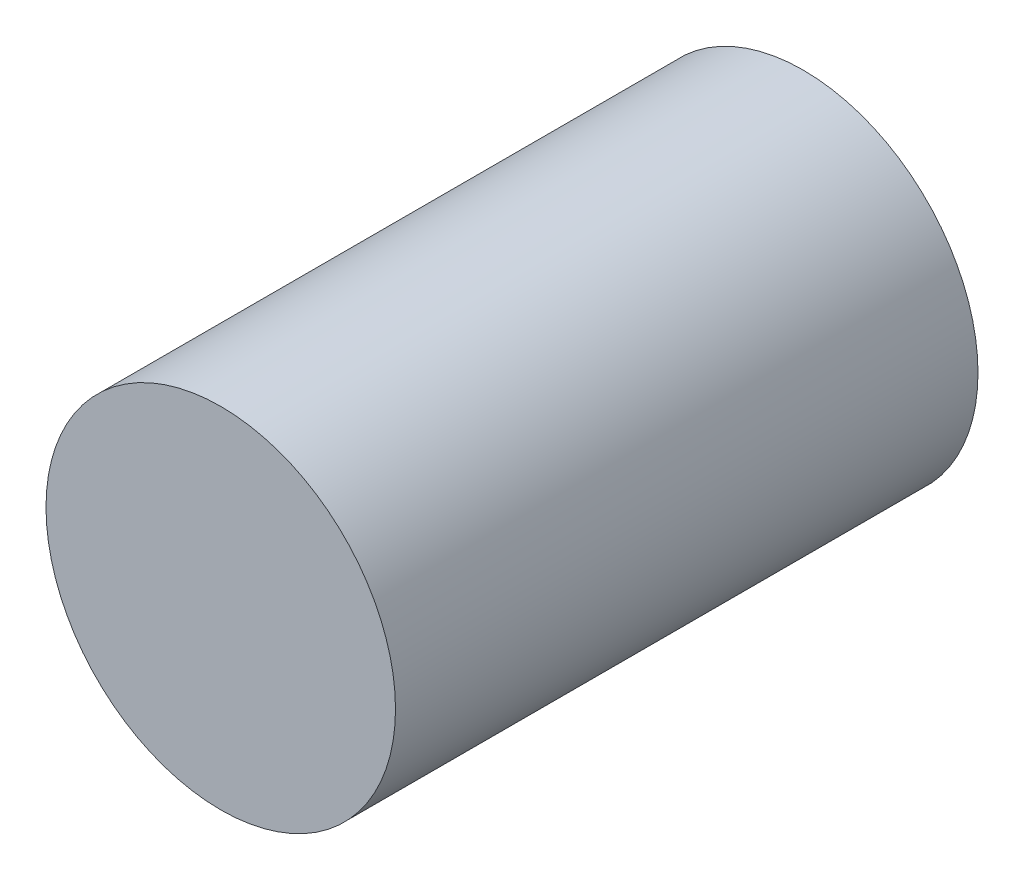
ISO-10303-21;
HEADER;
FILE_DESCRIPTION(('STEP AP214'),'2;1');
FILE_NAME('part.step','',(''),(''),'','','');
FILE_SCHEMA(('AUTOMOTIVE_DESIGN { 1 0 10303 214 1 1 1 1 }'));
ENDSEC;
DATA;
#1=APPLICATION_CONTEXT('core data for automotive mechanical design processes');
#2=APPLICATION_PROTOCOL_DEFINITION('international standard','automotive_design',2000,#1);
#3=PRODUCT_CONTEXT('',#1,'mechanical');
#4=PRODUCT('Part','Part','',(#3));
#5=PRODUCT_RELATED_PRODUCT_CATEGORY('part','',(#4));
#6=PRODUCT_DEFINITION_FORMATION('','',#4);
#7=PRODUCT_DEFINITION_CONTEXT('part definition',#1,'design');
#8=PRODUCT_DEFINITION('design','',#6,#7);
#9=PRODUCT_DEFINITION_SHAPE('','',#8);
#10=(LENGTH_UNIT() NAMED_UNIT(*) SI_UNIT(.MILLI.,.METRE.));
#11=(NAMED_UNIT(*) PLANE_ANGLE_UNIT() SI_UNIT($,.RADIAN.));
#12=(NAMED_UNIT(*) SI_UNIT($,.STERADIAN.) SOLID_ANGLE_UNIT());
#13=UNCERTAINTY_MEASURE_WITH_UNIT(LENGTH_MEASURE(1.E-05),#10,'distance_accuracy_value','');
#14=(GEOMETRIC_REPRESENTATION_CONTEXT(3) GLOBAL_UNCERTAINTY_ASSIGNED_CONTEXT((#13)) GLOBAL_UNIT_ASSIGNED_CONTEXT((#10,
#11,#12)) REPRESENTATION_CONTEXT('',''));
#15=CARTESIAN_POINT('',(0.,0.,0.));
#16=DIRECTION('',(0.,0.,1.));
#17=DIRECTION('',(1.,0.,0.));
#18=AXIS2_PLACEMENT_3D('',#15,#16,#17);
#19=CARTESIAN_POINT('',(0.,0.,100.));
#20=DIRECTION('',(0.,0.,-1.));
#21=DIRECTION('',(-1.,0.,0.));
#22=AXIS2_PLACEMENT_3D('',#19,#20,#21);
#23=CYLINDRICAL_SURFACE('',#22,30.);
#24=CARTESIAN_POINT('',(0.,0.,100.));
#25=DIRECTION('',(0.,0.,1.));
#26=DIRECTION('',(1.,0.,0.));
#27=AXIS2_PLACEMENT_3D('',#24,#25,#26);
#28=CIRCLE('',#27,30.);
#29=CARTESIAN_POINT('',(30.,0.,100.));
#30=VERTEX_POINT('',#29);
#31=EDGE_CURVE('E10',#30,#30,#28,.T.);
#32=ORIENTED_EDGE('',*,*,#31,.F.);
#33=EDGE_LOOP('',(#32));
#34=FACE_BOUND('',#33,.T.);
#35=CARTESIAN_POINT('',(0.,0.,0.));
#36=DIRECTION('',(0.,0.,-1.));
#37=DIRECTION('',(-1.,0.,0.));
#38=AXIS2_PLACEMENT_3D('',#35,#36,#37);
#39=CIRCLE('',#38,30.);
#40=CARTESIAN_POINT('',(-30.,0.,1.81993634052464E-13));
#41=VERTEX_POINT('',#40);
#42=EDGE_CURVE('E44',#41,#41,#39,.T.);
#43=ORIENTED_EDGE('',*,*,#42,.F.);
#44=EDGE_LOOP('',(#43));
#45=FACE_BOUND('',#44,.T.);
#46=ADVANCED_FACE('F37',(#34,#45),#23,.T.);
#47=CARTESIAN_POINT('',(0.,0.,100.));
#48=DIRECTION('',(0.,0.,1.));
#49=DIRECTION('',(1.,0.,0.));
#50=AXIS2_PLACEMENT_3D('',#47,#48,#49);
#51=PLANE('',#50);
#52=ORIENTED_EDGE('',*,*,#31,.T.);
#53=EDGE_LOOP('',(#52));
#54=FACE_BOUND('',#53,.T.);
#55=ADVANCED_FACE('F54',(#54),#51,.T.);
#56=CARTESIAN_POINT('',(0.,0.,146.969384566991));
#57=DIRECTION('',(0.,0.,-1.));
#58=DIRECTION('',(1.,0.,0.));
#59=AXIS2_PLACEMENT_3D('',#56,#57,#58);
#60=SPHERICAL_SURFACE('',#59,150.);
#61=ORIENTED_EDGE('',*,*,#42,.T.);
#62=EDGE_LOOP('',(#61));
#63=FACE_BOUND('',#62,.T.);
#64=ADVANCED_FACE('F51',(#63),#60,.T.);
#65=CLOSED_SHELL('',(#46,#55,#64));
#66=MANIFOLD_SOLID_BREP('B2',#65);
#67=ADVANCED_BREP_SHAPE_REPRESENTATION('',(#18,#66),#14);
#68=SHAPE_DEFINITION_REPRESENTATION(#9,#67);
ENDSEC;
END-ISO-10303-21;
